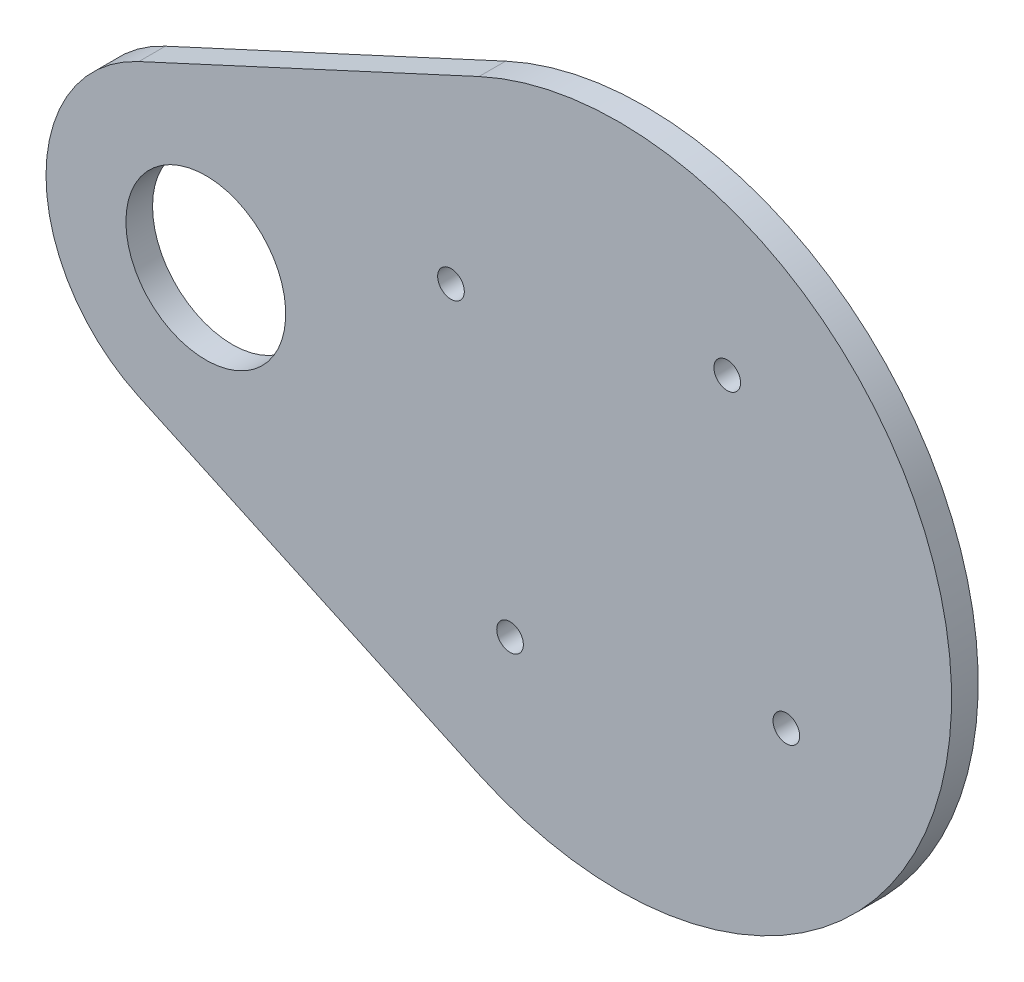
ISO-10303-21;
HEADER;
FILE_DESCRIPTION(('STEP AP214'),'2;1');
FILE_NAME('part.step','',(''),(''),'','','');
FILE_SCHEMA(('AUTOMOTIVE_DESIGN { 1 0 10303 214 1 1 1 1 }'));
ENDSEC;
DATA;
#1=APPLICATION_CONTEXT('core data for automotive mechanical design processes');
#2=APPLICATION_PROTOCOL_DEFINITION('international standard','automotive_design',2000,#1);
#3=PRODUCT_CONTEXT('',#1,'mechanical');
#4=PRODUCT('Part','Part','',(#3));
#5=PRODUCT_RELATED_PRODUCT_CATEGORY('part','',(#4));
#6=PRODUCT_DEFINITION_FORMATION('','',#4);
#7=PRODUCT_DEFINITION_CONTEXT('part definition',#1,'design');
#8=PRODUCT_DEFINITION('design','',#6,#7);
#9=PRODUCT_DEFINITION_SHAPE('','',#8);
#10=(LENGTH_UNIT() NAMED_UNIT(*) SI_UNIT(.MILLI.,.METRE.));
#11=(NAMED_UNIT(*) PLANE_ANGLE_UNIT() SI_UNIT($,.RADIAN.));
#12=(NAMED_UNIT(*) SI_UNIT($,.STERADIAN.) SOLID_ANGLE_UNIT());
#13=UNCERTAINTY_MEASURE_WITH_UNIT(LENGTH_MEASURE(1.E-05),#10,'distance_accuracy_value','');
#14=(GEOMETRIC_REPRESENTATION_CONTEXT(3) GLOBAL_UNCERTAINTY_ASSIGNED_CONTEXT((#13)) GLOBAL_UNIT_ASSIGNED_CONTEXT((#10,
#11,#12)) REPRESENTATION_CONTEXT('',''));
#15=CARTESIAN_POINT('',(0.,0.,0.));
#16=DIRECTION('',(0.,0.,1.));
#17=DIRECTION('',(1.,0.,0.));
#18=AXIS2_PLACEMENT_3D('',#15,#16,#17);
#19=CARTESIAN_POINT('',(-10.4838709677419,22.6955601281779,86.4037913840255));
#20=DIRECTION('',(0.419354838709677,-0.907822405127116,0.));
#21=DIRECTION('',(0.907822405127116,0.419354838709677,0.));
#22=AXIS2_PLACEMENT_3D('',#19,#20,#21);
#23=PLANE('',#22);
#24=DIRECTION('',(0.,0.,-1.));
#25=VECTOR('',#24,1.);
#26=CARTESIAN_POINT('',(-36.0322580645161,10.8938688615254,86.4037913840255));
#27=LINE('',#26,#25);
#28=CARTESIAN_POINT('',(-36.0322580645041,10.8938688614993,2.00000000000001));
#29=VERTEX_POINT('',#28);
#30=CARTESIAN_POINT('',(-36.0322580645161,10.8938688615254,0.));
#31=VERTEX_POINT('',#30);
#32=EDGE_CURVE('E79',#29,#31,#27,.T.);
#33=ORIENTED_EDGE('',*,*,#32,.F.);
#34=DIRECTION('',(0.907822405127116,0.419354838709677,0.));
#35=VECTOR('',#34,1.);
#36=CARTESIAN_POINT('',(-10.4838709677419,22.6955601281779,2.00000000000002));
#37=LINE('',#36,#35);
#38=CARTESIAN_POINT('',(-10.4838709677419,22.6955601281779,2.00000000000001));
#39=VERTEX_POINT('',#38);
#40=EDGE_CURVE('E54',#29,#39,#37,.T.);
#41=ORIENTED_EDGE('',*,*,#40,.T.);
#42=DIRECTION('',(0.,0.,-1.));
#43=VECTOR('',#42,1.);
#44=CARTESIAN_POINT('',(-10.4838709677419,22.6955601281779,86.4037913840255));
#45=LINE('',#44,#43);
#46=CARTESIAN_POINT('',(-10.4838709677419,22.6955601281779,0.));
#47=VERTEX_POINT('',#46);
#48=EDGE_CURVE('E98',#39,#47,#45,.T.);
#49=ORIENTED_EDGE('',*,*,#48,.T.);
#50=DIRECTION('',(-0.907822405127116,-0.419354838709677,0.));
#51=VECTOR('',#50,1.);
#52=CARTESIAN_POINT('',(-10.4838709677419,22.6955601281779,0.));
#53=LINE('',#52,#51);
#54=EDGE_CURVE('E93',#47,#31,#53,.T.);
#55=ORIENTED_EDGE('',*,*,#54,.T.);
#56=EDGE_LOOP('',(#33,#41,#49,#55));
#57=FACE_BOUND('',#56,.T.);
#58=ADVANCED_FACE('F37',(#57),#23,.F.);
#59=CARTESIAN_POINT('',(-30.9999999999758,-3.16474099922141E-11,86.4037913840255));
#60=DIRECTION('',(0.,0.,-1.));
#61=DIRECTION('',(-1.,0.,0.));
#62=AXIS2_PLACEMENT_3D('',#59,#60,#61);
#63=CYLINDRICAL_SURFACE('',#62,12.0000000000102);
#64=DIRECTION('',(0.,0.,-1.));
#65=VECTOR('',#64,1.);
#66=CARTESIAN_POINT('',(-36.0322580645161,-10.8938688615254,86.4037913840255));
#67=LINE('',#66,#65);
#68=CARTESIAN_POINT('',(-36.0322580645161,-10.8938688615254,2.00000000000001));
#69=VERTEX_POINT('',#68);
#70=CARTESIAN_POINT('',(-36.0322580645161,-10.8938688615254,0.));
#71=VERTEX_POINT('',#70);
#72=EDGE_CURVE('E74',#69,#71,#67,.T.);
#73=ORIENTED_EDGE('',*,*,#72,.F.);
#74=CARTESIAN_POINT('',(-30.9999999999758,-3.16474099922141E-11,2.00000000000002));
#75=DIRECTION('',(0.,0.,-1.));
#76=DIRECTION('',(-1.,0.,0.));
#77=AXIS2_PLACEMENT_3D('',#74,#75,#76);
#78=CIRCLE('',#77,12.0000000000102);
#79=EDGE_CURVE('E84',#69,#29,#78,.T.);
#80=ORIENTED_EDGE('',*,*,#79,.T.);
#81=ORIENTED_EDGE('',*,*,#32,.T.);
#82=CARTESIAN_POINT('',(-30.9999999999758,-3.16474099922141E-11,0.));
#83=DIRECTION('',(0.,0.,1.));
#84=DIRECTION('',(1.,0.,0.));
#85=AXIS2_PLACEMENT_3D('',#82,#83,#84);
#86=CIRCLE('',#85,12.0000000000102);
#87=EDGE_CURVE('E82',#31,#71,#86,.T.);
#88=ORIENTED_EDGE('',*,*,#87,.T.);
#89=EDGE_LOOP('',(#73,#80,#81,#88));
#90=FACE_BOUND('',#89,.T.);
#91=ADVANCED_FACE('F81',(#90),#63,.T.);
#92=CARTESIAN_POINT('',(-10.4838709677419,-22.6955601281779,86.4037913840255));
#93=DIRECTION('',(0.419354838709678,0.907822405127115,0.));
#94=DIRECTION('',(-0.907822405127115,0.419354838709678,0.));
#95=AXIS2_PLACEMENT_3D('',#92,#93,#94);
#96=PLANE('',#95);
#97=DIRECTION('',(0.,0.,-1.));
#98=VECTOR('',#97,1.);
#99=CARTESIAN_POINT('',(-10.4838709677419,-22.6955601281779,86.4037913840255));
#100=LINE('',#99,#98);
#101=CARTESIAN_POINT('',(-10.4838709677419,-22.6955601281779,2.00000000000002));
#102=VERTEX_POINT('',#101);
#103=CARTESIAN_POINT('',(-10.4838709677419,-22.6955601281779,0.));
#104=VERTEX_POINT('',#103);
#105=EDGE_CURVE('E131',#102,#104,#100,.T.);
#106=ORIENTED_EDGE('',*,*,#105,.F.);
#107=DIRECTION('',(-0.907822405127115,0.419354838709678,0.));
#108=VECTOR('',#107,1.);
#109=CARTESIAN_POINT('',(-10.4838709677419,-22.6955601281779,2.00000000000002));
#110=LINE('',#109,#108);
#111=EDGE_CURVE('E95',#102,#69,#110,.T.);
#112=ORIENTED_EDGE('',*,*,#111,.T.);
#113=ORIENTED_EDGE('',*,*,#72,.T.);
#114=DIRECTION('',(0.907822405127115,-0.419354838709678,0.));
#115=VECTOR('',#114,1.);
#116=CARTESIAN_POINT('',(-10.4838709677419,-22.6955601281779,0.));
#117=LINE('',#116,#115);
#118=EDGE_CURVE('E94',#71,#104,#117,.T.);
#119=ORIENTED_EDGE('',*,*,#118,.T.);
#120=EDGE_LOOP('',(#106,#112,#113,#119));
#121=FACE_BOUND('',#120,.T.);
#122=ADVANCED_FACE('F162',(#121),#96,.F.);
#123=CARTESIAN_POINT('',(0.,0.,86.4037913840255));
#124=DIRECTION('',(0.,0.,-1.));
#125=DIRECTION('',(-1.,0.,0.));
#126=AXIS2_PLACEMENT_3D('',#123,#124,#125);
#127=CYLINDRICAL_SURFACE('',#126,25.);
#128=ORIENTED_EDGE('',*,*,#48,.F.);
#129=CARTESIAN_POINT('',(0.,0.,2.00000000000002));
#130=DIRECTION('',(0.,0.,-1.));
#131=DIRECTION('',(-1.,0.,0.));
#132=AXIS2_PLACEMENT_3D('',#129,#130,#131);
#133=CIRCLE('',#132,25.);
#134=EDGE_CURVE('E132',#39,#102,#133,.T.);
#135=ORIENTED_EDGE('',*,*,#134,.T.);
#136=ORIENTED_EDGE('',*,*,#105,.T.);
#137=CARTESIAN_POINT('',(0.,0.,0.));
#138=DIRECTION('',(0.,0.,1.));
#139=DIRECTION('',(1.,0.,0.));
#140=AXIS2_PLACEMENT_3D('',#137,#138,#139);
#141=CIRCLE('',#140,25.);
#142=EDGE_CURVE('E123',#104,#47,#141,.T.);
#143=ORIENTED_EDGE('',*,*,#142,.T.);
#144=EDGE_LOOP('',(#128,#135,#136,#143));
#145=FACE_BOUND('',#144,.T.);
#146=ADVANCED_FACE('F170',(#145),#127,.T.);
#147=CARTESIAN_POINT('',(-12.5899519946088,8.15433067599406,86.4037913840255));
#148=DIRECTION('',(0.,0.,-1.));
#149=DIRECTION('',(-1.,0.,0.));
#150=AXIS2_PLACEMENT_3D('',#147,#148,#149);
#151=CYLINDRICAL_SURFACE('',#150,1.00000000000058);
#152=CARTESIAN_POINT('',(-12.5899519946088,8.15433067599406,2.00000000000002));
#153=DIRECTION('',(0.,0.,-1.));
#154=DIRECTION('',(-1.,0.,0.));
#155=AXIS2_PLACEMENT_3D('',#152,#153,#154);
#156=CIRCLE('',#155,1.00000000000058);
#157=CARTESIAN_POINT('',(-13.5899519946094,8.15433067599406,2.00000000000002));
#158=VERTEX_POINT('',#157);
#159=EDGE_CURVE('E109',#158,#158,#156,.F.);
#160=ORIENTED_EDGE('',*,*,#159,.T.);
#161=EDGE_LOOP('',(#160));
#162=FACE_BOUND('',#161,.T.);
#163=CARTESIAN_POINT('',(-12.5899519946088,8.15433067599406,0.));
#164=DIRECTION('',(0.,0.,1.));
#165=DIRECTION('',(1.,0.,0.));
#166=AXIS2_PLACEMENT_3D('',#163,#164,#165);
#167=CIRCLE('',#166,1.00000000000058);
#168=CARTESIAN_POINT('',(-11.5899519946083,8.15433067599406,0.));
#169=VERTEX_POINT('',#168);
#170=EDGE_CURVE('E105',#169,#169,#167,.F.);
#171=ORIENTED_EDGE('',*,*,#170,.T.);
#172=EDGE_LOOP('',(#171));
#173=FACE_BOUND('',#172,.T.);
#174=ADVANCED_FACE('F166',(#162,#173),#151,.F.);
#175=CARTESIAN_POINT('',(12.5899519946081,-8.1543306759936,86.4037913840255));
#176=DIRECTION('',(0.,0.,-1.));
#177=DIRECTION('',(-1.,0.,0.));
#178=AXIS2_PLACEMENT_3D('',#175,#176,#177);
#179=CYLINDRICAL_SURFACE('',#178,1.00000000000045);
#180=CARTESIAN_POINT('',(12.5899519946081,-8.1543306759936,2.00000000000003));
#181=DIRECTION('',(0.,0.,-1.));
#182=DIRECTION('',(-1.,0.,0.));
#183=AXIS2_PLACEMENT_3D('',#180,#181,#182);
#184=CIRCLE('',#183,1.00000000000045);
#185=CARTESIAN_POINT('',(11.5899519946077,-8.1543306759936,2.00000000000003));
#186=VERTEX_POINT('',#185);
#187=EDGE_CURVE('E108',#186,#186,#184,.F.);
#188=ORIENTED_EDGE('',*,*,#187,.T.);
#189=EDGE_LOOP('',(#188));
#190=FACE_BOUND('',#189,.T.);
#191=CARTESIAN_POINT('',(12.5899519946081,-8.1543306759936,0.));
#192=DIRECTION('',(0.,0.,1.));
#193=DIRECTION('',(1.,0.,0.));
#194=AXIS2_PLACEMENT_3D('',#191,#192,#193);
#195=CIRCLE('',#194,1.00000000000045);
#196=CARTESIAN_POINT('',(13.5899519946086,-8.1543306759936,0.));
#197=VERTEX_POINT('',#196);
#198=EDGE_CURVE('E110',#197,#197,#195,.F.);
#199=ORIENTED_EDGE('',*,*,#198,.T.);
#200=EDGE_LOOP('',(#199));
#201=FACE_BOUND('',#200,.T.);
#202=ADVANCED_FACE('F169',(#190,#201),#179,.F.);
#203=CARTESIAN_POINT('',(-8.15433067599419,-12.5899519946083,86.4037913840255));
#204=DIRECTION('',(0.,0.,-1.));
#205=DIRECTION('',(-1.,0.,0.));
#206=AXIS2_PLACEMENT_3D('',#203,#204,#205);
#207=CYLINDRICAL_SURFACE('',#206,1.00000000000093);
#208=CARTESIAN_POINT('',(-8.15433067599419,-12.5899519946083,2.00000000000002));
#209=DIRECTION('',(0.,0.,-1.));
#210=DIRECTION('',(-1.,0.,0.));
#211=AXIS2_PLACEMENT_3D('',#208,#209,#210);
#212=CIRCLE('',#211,1.00000000000093);
#213=CARTESIAN_POINT('',(-9.15433067599512,-12.5899519946083,2.00000000000002));
#214=VERTEX_POINT('',#213);
#215=EDGE_CURVE('E113',#214,#214,#212,.F.);
#216=ORIENTED_EDGE('',*,*,#215,.T.);
#217=EDGE_LOOP('',(#216));
#218=FACE_BOUND('',#217,.T.);
#219=CARTESIAN_POINT('',(-8.15433067599419,-12.5899519946083,0.));
#220=DIRECTION('',(0.,0.,1.));
#221=DIRECTION('',(1.,0.,0.));
#222=AXIS2_PLACEMENT_3D('',#219,#220,#221);
#223=CIRCLE('',#222,1.00000000000093);
#224=CARTESIAN_POINT('',(-7.15433067599326,-12.5899519946083,0.));
#225=VERTEX_POINT('',#224);
#226=EDGE_CURVE('E114',#225,#225,#223,.F.);
#227=ORIENTED_EDGE('',*,*,#226,.T.);
#228=EDGE_LOOP('',(#227));
#229=FACE_BOUND('',#228,.T.);
#230=ADVANCED_FACE('F153',(#218,#229),#207,.F.);
#231=CARTESIAN_POINT('',(8.15433067599347,12.5899519946087,86.4037913840255));
#232=DIRECTION('',(0.,0.,-1.));
#233=DIRECTION('',(-1.,0.,0.));
#234=AXIS2_PLACEMENT_3D('',#231,#232,#233);
#235=CYLINDRICAL_SURFACE('',#234,1.);
#236=CARTESIAN_POINT('',(8.15433067599347,12.5899519946087,2.00000000000002));
#237=DIRECTION('',(0.,0.,-1.));
#238=DIRECTION('',(-1.,0.,0.));
#239=AXIS2_PLACEMENT_3D('',#236,#237,#238);
#240=CIRCLE('',#239,1.);
#241=CARTESIAN_POINT('',(7.15433067599347,12.5899519946087,2.00000000000002));
#242=VERTEX_POINT('',#241);
#243=EDGE_CURVE('E117',#242,#242,#240,.F.);
#244=ORIENTED_EDGE('',*,*,#243,.T.);
#245=EDGE_LOOP('',(#244));
#246=FACE_BOUND('',#245,.T.);
#247=CARTESIAN_POINT('',(8.15433067599347,12.5899519946087,0.));
#248=DIRECTION('',(0.,0.,1.));
#249=DIRECTION('',(1.,0.,0.));
#250=AXIS2_PLACEMENT_3D('',#247,#248,#249);
#251=CIRCLE('',#250,1.);
#252=CARTESIAN_POINT('',(9.15433067599347,12.5899519946087,0.));
#253=VERTEX_POINT('',#252);
#254=EDGE_CURVE('E118',#253,#253,#251,.F.);
#255=ORIENTED_EDGE('',*,*,#254,.T.);
#256=EDGE_LOOP('',(#255));
#257=FACE_BOUND('',#256,.T.);
#258=ADVANCED_FACE('F145',(#246,#257),#235,.F.);
#259=CARTESIAN_POINT('',(-31.0000000000008,-1.76703497826628E-13,86.4037913840255));
#260=DIRECTION('',(0.,0.,-1.));
#261=DIRECTION('',(-1.,0.,0.));
#262=AXIS2_PLACEMENT_3D('',#259,#260,#261);
#263=CYLINDRICAL_SURFACE('',#262,6.);
#264=CARTESIAN_POINT('',(-31.0000000000008,-1.76703497826628E-13,2.00000000000002));
#265=DIRECTION('',(0.,0.,-1.));
#266=DIRECTION('',(-1.,0.,0.));
#267=AXIS2_PLACEMENT_3D('',#264,#265,#266);
#268=CIRCLE('',#267,6.);
#269=CARTESIAN_POINT('',(-37.0000000000008,-1.76703497826628E-13,2.00000000000001));
#270=VERTEX_POINT('',#269);
#271=EDGE_CURVE('E11',#270,#270,#268,.T.);
#272=ORIENTED_EDGE('',*,*,#271,.F.);
#273=EDGE_LOOP('',(#272));
#274=FACE_BOUND('',#273,.T.);
#275=CARTESIAN_POINT('',(-31.0000000000008,-1.76703497826628E-13,0.));
#276=DIRECTION('',(0.,0.,1.));
#277=DIRECTION('',(1.,0.,0.));
#278=AXIS2_PLACEMENT_3D('',#275,#276,#277);
#279=CIRCLE('',#278,6.);
#280=CARTESIAN_POINT('',(-25.0000000000008,-1.76703497826628E-13,0.));
#281=VERTEX_POINT('',#280);
#282=EDGE_CURVE('E46',#281,#281,#279,.T.);
#283=ORIENTED_EDGE('',*,*,#282,.F.);
#284=EDGE_LOOP('',(#283));
#285=FACE_BOUND('',#284,.T.);
#286=ADVANCED_FACE('F143',(#274,#285),#263,.F.);
#287=CARTESIAN_POINT('',(0.,0.,0.));
#288=DIRECTION('',(0.,0.,1.));
#289=DIRECTION('',(1.,0.,0.));
#290=AXIS2_PLACEMENT_3D('',#287,#288,#289);
#291=PLANE('',#290);
#292=ORIENTED_EDGE('',*,*,#254,.F.);
#293=EDGE_LOOP('',(#292));
#294=FACE_BOUND('',#293,.T.);
#295=ORIENTED_EDGE('',*,*,#226,.F.);
#296=EDGE_LOOP('',(#295));
#297=FACE_BOUND('',#296,.T.);
#298=ORIENTED_EDGE('',*,*,#198,.F.);
#299=EDGE_LOOP('',(#298));
#300=FACE_BOUND('',#299,.T.);
#301=ORIENTED_EDGE('',*,*,#170,.F.);
#302=EDGE_LOOP('',(#301));
#303=FACE_BOUND('',#302,.T.);
#304=ORIENTED_EDGE('',*,*,#54,.F.);
#305=ORIENTED_EDGE('',*,*,#142,.F.);
#306=ORIENTED_EDGE('',*,*,#118,.F.);
#307=ORIENTED_EDGE('',*,*,#87,.F.);
#308=EDGE_LOOP('',(#304,#305,#306,#307));
#309=FACE_BOUND('',#308,.T.);
#310=ORIENTED_EDGE('',*,*,#282,.T.);
#311=EDGE_LOOP('',(#310));
#312=FACE_BOUND('',#311,.T.);
#313=ADVANCED_FACE('F90',(#294,#297,#300,#303,#309,#312),#291,.F.);
#314=CARTESIAN_POINT('',(-35.1980520109122,1.62060461361862,2.00000000000002));
#315=DIRECTION('',(0.,0.,-1.));
#316=DIRECTION('',(-0.932900446869206,0.360134358581954,0.));
#317=AXIS2_PLACEMENT_3D('',#314,#315,#316);
#318=PLANE('',#317);
#319=ORIENTED_EDGE('',*,*,#159,.F.);
#320=EDGE_LOOP('',(#319));
#321=FACE_BOUND('',#320,.T.);
#322=ORIENTED_EDGE('',*,*,#215,.F.);
#323=EDGE_LOOP('',(#322));
#324=FACE_BOUND('',#323,.T.);
#325=ORIENTED_EDGE('',*,*,#271,.T.);
#326=EDGE_LOOP('',(#325));
#327=FACE_BOUND('',#326,.T.);
#328=ORIENTED_EDGE('',*,*,#243,.F.);
#329=EDGE_LOOP('',(#328));
#330=FACE_BOUND('',#329,.T.);
#331=ORIENTED_EDGE('',*,*,#187,.F.);
#332=EDGE_LOOP('',(#331));
#333=FACE_BOUND('',#332,.T.);
#334=ORIENTED_EDGE('',*,*,#79,.F.);
#335=ORIENTED_EDGE('',*,*,#111,.F.);
#336=ORIENTED_EDGE('',*,*,#134,.F.);
#337=ORIENTED_EDGE('',*,*,#40,.F.);
#338=EDGE_LOOP('',(#334,#335,#336,#337));
#339=FACE_BOUND('',#338,.T.);
#340=ADVANCED_FACE('F39',(#321,#324,#327,#330,#333,#339),#318,.F.);
#341=CLOSED_SHELL('',(#58,#91,#122,#146,#174,#202,#230,#258,#286,#313,#340));
#342=MANIFOLD_SOLID_BREP('B2',#341);
#343=ADVANCED_BREP_SHAPE_REPRESENTATION('',(#18,#342),#14);
#344=SHAPE_DEFINITION_REPRESENTATION(#9,#343);
ENDSEC;
END-ISO-10303-21;
